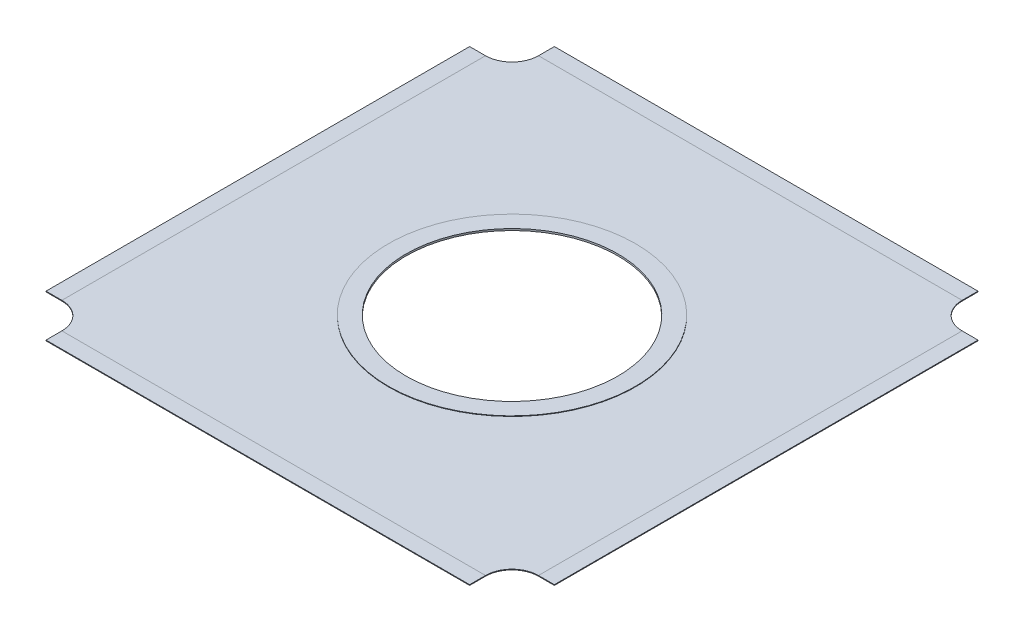
ISO-10303-21;
HEADER;
FILE_DESCRIPTION(('STEP AP214'),'2;1');
FILE_NAME('part.step','',(''),(''),'','','');
FILE_SCHEMA(('AUTOMOTIVE_DESIGN { 1 0 10303 214 1 1 1 1 }'));
ENDSEC;
DATA;
#1=APPLICATION_CONTEXT('core data for automotive mechanical design processes');
#2=APPLICATION_PROTOCOL_DEFINITION('international standard','automotive_design',2000,#1);
#3=PRODUCT_CONTEXT('',#1,'mechanical');
#4=PRODUCT('Part','Part','',(#3));
#5=PRODUCT_RELATED_PRODUCT_CATEGORY('part','',(#4));
#6=PRODUCT_DEFINITION_FORMATION('','',#4);
#7=PRODUCT_DEFINITION_CONTEXT('part definition',#1,'design');
#8=PRODUCT_DEFINITION('design','',#6,#7);
#9=PRODUCT_DEFINITION_SHAPE('','',#8);
#10=(LENGTH_UNIT() NAMED_UNIT(*) SI_UNIT(.MILLI.,.METRE.));
#11=(NAMED_UNIT(*) PLANE_ANGLE_UNIT() SI_UNIT($,.RADIAN.));
#12=(NAMED_UNIT(*) SI_UNIT($,.STERADIAN.) SOLID_ANGLE_UNIT());
#13=UNCERTAINTY_MEASURE_WITH_UNIT(LENGTH_MEASURE(1.E-05),#10,'distance_accuracy_value','');
#14=(GEOMETRIC_REPRESENTATION_CONTEXT(3) GLOBAL_UNCERTAINTY_ASSIGNED_CONTEXT((#13)) GLOBAL_UNIT_ASSIGNED_CONTEXT((#10,
#11,#12)) REPRESENTATION_CONTEXT('',''));
#15=CARTESIAN_POINT('',(0.,0.,0.));
#16=DIRECTION('',(0.,0.,1.));
#17=DIRECTION('',(1.,0.,0.));
#18=AXIS2_PLACEMENT_3D('',#15,#16,#17);
#19=CARTESIAN_POINT('',(0.,0.635,0.));
#20=DIRECTION('',(0.,-1.,0.));
#21=DIRECTION('',(0.,0.,-1.));
#22=AXIS2_PLACEMENT_3D('',#19,#20,#21);
#23=CYLINDRICAL_SURFACE('',#22,76.2);
#24=CARTESIAN_POINT('',(0.,0.635,0.));
#25=DIRECTION('',(0.,1.,0.));
#26=DIRECTION('',(0.,0.,1.));
#27=AXIS2_PLACEMENT_3D('',#24,#25,#26);
#28=CIRCLE('',#27,76.2);
#29=CARTESIAN_POINT('',(0.,0.635,76.2));
#30=VERTEX_POINT('',#29);
#31=EDGE_CURVE('E60',#30,#30,#28,.T.);
#32=ORIENTED_EDGE('',*,*,#31,.T.);
#33=EDGE_LOOP('',(#32));
#34=FACE_BOUND('',#33,.T.);
#35=CARTESIAN_POINT('',(0.,-0.635,0.));
#36=DIRECTION('',(0.,1.,0.));
#37=DIRECTION('',(0.,0.,1.));
#38=AXIS2_PLACEMENT_3D('',#35,#36,#37);
#39=CIRCLE('',#38,76.2);
#40=CARTESIAN_POINT('',(0.,-0.635,76.2));
#41=VERTEX_POINT('',#40);
#42=EDGE_CURVE('E66',#41,#41,#39,.T.);
#43=ORIENTED_EDGE('',*,*,#42,.F.);
#44=EDGE_LOOP('',(#43));
#45=FACE_BOUND('',#44,.T.);
#46=ADVANCED_FACE('F53',(#34,#45),#23,.F.);
#47=CARTESIAN_POINT('',(0.,0.635,0.));
#48=DIRECTION('',(0.,-1.,0.));
#49=DIRECTION('',(0.,0.,-1.));
#50=AXIS2_PLACEMENT_3D('',#47,#48,#49);
#51=CYLINDRICAL_SURFACE('',#50,88.9);
#52=CARTESIAN_POINT('',(0.,0.635,0.));
#53=DIRECTION('',(0.,1.,0.));
#54=DIRECTION('',(0.,0.,1.));
#55=AXIS2_PLACEMENT_3D('',#52,#53,#54);
#56=CIRCLE('',#55,88.9);
#57=CARTESIAN_POINT('',(0.,0.635,88.9));
#58=VERTEX_POINT('',#57);
#59=EDGE_CURVE('E12',#58,#58,#56,.T.);
#60=ORIENTED_EDGE('',*,*,#59,.F.);
#61=EDGE_LOOP('',(#60));
#62=FACE_BOUND('',#61,.T.);
#63=CARTESIAN_POINT('',(0.,-0.635,0.));
#64=DIRECTION('',(0.,1.,0.));
#65=DIRECTION('',(0.,0.,1.));
#66=AXIS2_PLACEMENT_3D('',#63,#64,#65);
#67=CIRCLE('',#66,88.9);
#68=CARTESIAN_POINT('',(0.,-0.635,88.9));
#69=VERTEX_POINT('',#68);
#70=EDGE_CURVE('E56',#69,#69,#67,.T.);
#71=ORIENTED_EDGE('',*,*,#70,.T.);
#72=EDGE_LOOP('',(#71));
#73=FACE_BOUND('',#72,.T.);
#74=ADVANCED_FACE('F73',(#62,#73),#51,.T.);
#75=CARTESIAN_POINT('',(0.,0.635,0.));
#76=DIRECTION('',(0.,1.,0.));
#77=DIRECTION('',(0.,0.,1.));
#78=AXIS2_PLACEMENT_3D('',#75,#76,#77);
#79=PLANE('',#78);
#80=ORIENTED_EDGE('',*,*,#31,.F.);
#81=EDGE_LOOP('',(#80));
#82=FACE_BOUND('',#81,.T.);
#83=ORIENTED_EDGE('',*,*,#59,.T.);
#84=EDGE_LOOP('',(#83));
#85=FACE_BOUND('',#84,.T.);
#86=ADVANCED_FACE('F77',(#82,#85),#79,.T.);
#87=CARTESIAN_POINT('',(0.,-0.635,0.));
#88=DIRECTION('',(0.,1.,0.));
#89=DIRECTION('',(0.,0.,1.));
#90=AXIS2_PLACEMENT_3D('',#87,#88,#89);
#91=PLANE('',#90);
#92=ORIENTED_EDGE('',*,*,#42,.T.);
#93=EDGE_LOOP('',(#92));
#94=FACE_BOUND('',#93,.T.);
#95=ORIENTED_EDGE('',*,*,#70,.F.);
#96=EDGE_LOOP('',(#95));
#97=FACE_BOUND('',#96,.T.);
#98=ADVANCED_FACE('F75',(#94,#97),#91,.F.);
#99=CLOSED_SHELL('',(#46,#74,#86,#98));
#100=MANIFOLD_SOLID_BREP('B2',#99);
#101=CARTESIAN_POINT('',(0.,0.254,0.));
#102=DIRECTION('',(0.,1.,0.));
#103=DIRECTION('',(0.,0.,1.));
#104=AXIS2_PLACEMENT_3D('',#101,#102,#103);
#105=PLANE('',#104);
#106=DIRECTION('',(0.,0.,1.));
#107=VECTOR('',#106,1.);
#108=CARTESIAN_POINT('',(152.400000000001,0.254,7.40148683083457E-13));
#109=LINE('',#108,#107);
#110=CARTESIAN_POINT('',(152.4,0.254,171.45));
#111=VERTEX_POINT('',#110);
#112=CARTESIAN_POINT('',(152.4,0.254,182.88));
#113=VERTEX_POINT('',#112);
#114=EDGE_CURVE('E687',#111,#113,#109,.T.);
#115=ORIENTED_EDGE('',*,*,#114,.F.);
#116=DIRECTION('',(-1.,0.,0.));
#117=VECTOR('',#116,1.);
#118=CARTESIAN_POINT('',(0.,0.254,171.45));
#119=LINE('',#118,#117);
#120=CARTESIAN_POINT('',(-152.4,0.254,171.45));
#121=VERTEX_POINT('',#120);
#122=EDGE_CURVE('E51',#111,#121,#119,.T.);
#123=ORIENTED_EDGE('',*,*,#122,.T.);
#124=DIRECTION('',(0.,0.,1.));
#125=VECTOR('',#124,1.);
#126=CARTESIAN_POINT('',(-152.399999999998,0.254,-1.48029736616687E-12));
#127=LINE('',#126,#125);
#128=CARTESIAN_POINT('',(-152.4,0.254,182.88));
#129=VERTEX_POINT('',#128);
#130=EDGE_CURVE('E383',#121,#129,#127,.T.);
#131=ORIENTED_EDGE('',*,*,#130,.T.);
#132=DIRECTION('',(1.,0.,0.));
#133=VECTOR('',#132,1.);
#134=CARTESIAN_POINT('',(0.,0.254,182.88));
#135=LINE('',#134,#133);
#136=EDGE_CURVE('E685',#129,#113,#135,.T.);
#137=ORIENTED_EDGE('',*,*,#136,.T.);
#138=EDGE_LOOP('',(#115,#123,#131,#137));
#139=FACE_BOUND('',#138,.T.);
#140=ADVANCED_FACE('F132',(#139),#105,.T.);
#141=CARTESIAN_POINT('',(0.,-0.254,0.));
#142=DIRECTION('',(0.,1.,0.));
#143=DIRECTION('',(0.,0.,1.));
#144=AXIS2_PLACEMENT_3D('',#141,#142,#143);
#145=PLANE('',#144);
#146=CARTESIAN_POINT('',(0.,-0.254,0.));
#147=DIRECTION('',(0.,1.,0.));
#148=DIRECTION('',(0.,0.,1.));
#149=AXIS2_PLACEMENT_3D('',#146,#147,#148);
#150=CIRCLE('',#149,88.9);
#151=CARTESIAN_POINT('',(0.,-0.254,88.9));
#152=VERTEX_POINT('',#151);
#153=EDGE_CURVE('E324',#152,#152,#150,.T.);
#154=ORIENTED_EDGE('',*,*,#153,.T.);
#155=EDGE_LOOP('',(#154));
#156=FACE_BOUND('',#155,.T.);
#157=CARTESIAN_POINT('',(171.45,-0.254,171.45));
#158=DIRECTION('',(0.,1.,0.));
#159=DIRECTION('',(0.,0.,1.));
#160=AXIS2_PLACEMENT_3D('',#157,#158,#159);
#161=CIRCLE('',#160,19.05);
#162=CARTESIAN_POINT('',(152.4,-0.254,171.45));
#163=VERTEX_POINT('',#162);
#164=CARTESIAN_POINT('',(171.45,-0.254,152.4));
#165=VERTEX_POINT('',#164);
#166=EDGE_CURVE('E304',#163,#165,#161,.F.);
#167=ORIENTED_EDGE('',*,*,#166,.F.);
#168=DIRECTION('',(-1.,0.,0.));
#169=VECTOR('',#168,1.);
#170=CARTESIAN_POINT('',(0.,-0.254,171.45));
#171=LINE('',#170,#169);
#172=CARTESIAN_POINT('',(-152.4,-0.254,171.45));
#173=VERTEX_POINT('',#172);
#174=EDGE_CURVE('E141',#163,#173,#171,.T.);
#175=ORIENTED_EDGE('',*,*,#174,.T.);
#176=CARTESIAN_POINT('',(-171.45,-0.254,171.45));
#177=DIRECTION('',(0.,1.,0.));
#178=DIRECTION('',(0.,0.,1.));
#179=AXIS2_PLACEMENT_3D('',#176,#177,#178);
#180=CIRCLE('',#179,19.05);
#181=CARTESIAN_POINT('',(-171.45,-0.254,152.4));
#182=VERTEX_POINT('',#181);
#183=EDGE_CURVE('E293',#173,#182,#180,.T.);
#184=ORIENTED_EDGE('',*,*,#183,.T.);
#185=DIRECTION('',(0.,0.,1.));
#186=VECTOR('',#185,1.);
#187=CARTESIAN_POINT('',(-171.45,-0.254,0.));
#188=LINE('',#187,#186);
#189=CARTESIAN_POINT('',(-171.45,-0.254,-152.4));
#190=VERTEX_POINT('',#189);
#191=EDGE_CURVE('E363',#190,#182,#188,.T.);
#192=ORIENTED_EDGE('',*,*,#191,.F.);
#193=CARTESIAN_POINT('',(-171.45,-0.254,-171.45));
#194=DIRECTION('',(0.,1.,0.));
#195=DIRECTION('',(0.,0.,1.));
#196=AXIS2_PLACEMENT_3D('',#193,#194,#195);
#197=CIRCLE('',#196,19.05);
#198=CARTESIAN_POINT('',(-152.4,-0.254,-171.45));
#199=VERTEX_POINT('',#198);
#200=EDGE_CURVE('E282',#190,#199,#197,.T.);
#201=ORIENTED_EDGE('',*,*,#200,.T.);
#202=DIRECTION('',(1.,0.,0.));
#203=VECTOR('',#202,1.);
#204=CARTESIAN_POINT('',(0.,-0.254,-171.45));
#205=LINE('',#204,#203);
#206=CARTESIAN_POINT('',(152.4,-0.254,-171.45));
#207=VERTEX_POINT('',#206);
#208=EDGE_CURVE('E208',#199,#207,#205,.T.);
#209=ORIENTED_EDGE('',*,*,#208,.T.);
#210=CARTESIAN_POINT('',(171.45,-0.254,-171.45));
#211=DIRECTION('',(0.,1.,0.));
#212=DIRECTION('',(0.,0.,1.));
#213=AXIS2_PLACEMENT_3D('',#210,#211,#212);
#214=CIRCLE('',#213,19.05);
#215=CARTESIAN_POINT('',(171.45,-0.254,-152.4));
#216=VERTEX_POINT('',#215);
#217=EDGE_CURVE('E316',#216,#207,#214,.F.);
#218=ORIENTED_EDGE('',*,*,#217,.F.);
#219=DIRECTION('',(0.,0.,1.));
#220=VECTOR('',#219,1.);
#221=CARTESIAN_POINT('',(171.45,-0.254,0.));
#222=LINE('',#221,#220);
#223=EDGE_CURVE('E368',#216,#165,#222,.T.);
#224=ORIENTED_EDGE('',*,*,#223,.T.);
#225=EDGE_LOOP('',(#167,#175,#184,#192,#201,#209,#218,#224));
#226=FACE_BOUND('',#225,.T.);
#227=ADVANCED_FACE('F373',(#156,#226),#145,.F.);
#228=DIRECTION('',(1.,0.,0.));
#229=VECTOR('',#228,1.);
#230=CARTESIAN_POINT('',(7.40148683083446E-13,0.254,-152.400000000001));
#231=LINE('',#230,#229);
#232=CARTESIAN_POINT('',(171.45,0.254,-152.4));
#233=VERTEX_POINT('',#232);
#234=CARTESIAN_POINT('',(182.88,0.254,-152.4));
#235=VERTEX_POINT('',#234);
#236=EDGE_CURVE('E697',#233,#235,#231,.T.);
#237=ORIENTED_EDGE('',*,*,#236,.F.);
#238=DIRECTION('',(0.,0.,1.));
#239=VECTOR('',#238,1.);
#240=CARTESIAN_POINT('',(171.45,0.254,0.));
#241=LINE('',#240,#239);
#242=CARTESIAN_POINT('',(171.45,0.254,152.4));
#243=VERTEX_POINT('',#242);
#244=EDGE_CURVE('E370',#233,#243,#241,.T.);
#245=ORIENTED_EDGE('',*,*,#244,.T.);
#246=DIRECTION('',(1.,0.,0.));
#247=VECTOR('',#246,1.);
#248=CARTESIAN_POINT('',(0.,0.254,152.4));
#249=LINE('',#248,#247);
#250=CARTESIAN_POINT('',(182.88,0.254,152.4));
#251=VERTEX_POINT('',#250);
#252=EDGE_CURVE('E692',#243,#251,#249,.T.);
#253=ORIENTED_EDGE('',*,*,#252,.T.);
#254=DIRECTION('',(0.,0.,1.));
#255=VECTOR('',#254,1.);
#256=CARTESIAN_POINT('',(182.88,0.254,0.));
#257=LINE('',#256,#255);
#258=EDGE_CURVE('E694',#235,#251,#257,.T.);
#259=ORIENTED_EDGE('',*,*,#258,.F.);
#260=EDGE_LOOP('',(#237,#245,#253,#259));
#261=FACE_BOUND('',#260,.T.);
#262=ADVANCED_FACE('F423',(#261),#105,.T.);
#263=ORIENTED_EDGE('',*,*,#174,.F.);
#264=DIRECTION('',(0.,0.,1.));
#265=VECTOR('',#264,1.);
#266=CARTESIAN_POINT('',(152.400000000001,-0.254,7.40148683083457E-13));
#267=LINE('',#266,#265);
#268=CARTESIAN_POINT('',(152.4,-0.254,182.88));
#269=VERTEX_POINT('',#268);
#270=EDGE_CURVE('E301',#163,#269,#267,.T.);
#271=ORIENTED_EDGE('',*,*,#270,.T.);
#272=DIRECTION('',(1.,0.,0.));
#273=VECTOR('',#272,1.);
#274=CARTESIAN_POINT('',(0.,-0.254,182.88));
#275=LINE('',#274,#273);
#276=CARTESIAN_POINT('',(-152.4,-0.254,182.88));
#277=VERTEX_POINT('',#276);
#278=EDGE_CURVE('E298',#277,#269,#275,.T.);
#279=ORIENTED_EDGE('',*,*,#278,.F.);
#280=DIRECTION('',(0.,0.,1.));
#281=VECTOR('',#280,1.);
#282=CARTESIAN_POINT('',(-152.399999999998,-0.254,-1.48029736616687E-12));
#283=LINE('',#282,#281);
#284=EDGE_CURVE('E296',#173,#277,#283,.T.);
#285=ORIENTED_EDGE('',*,*,#284,.F.);
#286=EDGE_LOOP('',(#263,#271,#279,#285));
#287=FACE_BOUND('',#286,.T.);
#288=ADVANCED_FACE('F388',(#287),#145,.F.);
#289=DIRECTION('',(0.,0.,1.));
#290=VECTOR('',#289,1.);
#291=CARTESIAN_POINT('',(-152.399999999999,0.254,7.40148683083432E-13));
#292=LINE('',#291,#290);
#293=CARTESIAN_POINT('',(-152.4,0.254,-182.88));
#294=VERTEX_POINT('',#293);
#295=CARTESIAN_POINT('',(-152.4,0.254,-171.45));
#296=VERTEX_POINT('',#295);
#297=EDGE_CURVE('E273',#294,#296,#292,.T.);
#298=ORIENTED_EDGE('',*,*,#297,.T.);
#299=DIRECTION('',(1.,0.,0.));
#300=VECTOR('',#299,1.);
#301=CARTESIAN_POINT('',(0.,0.254,-171.45));
#302=LINE('',#301,#300);
#303=CARTESIAN_POINT('',(152.4,0.254,-171.45));
#304=VERTEX_POINT('',#303);
#305=EDGE_CURVE('E149',#296,#304,#302,.T.);
#306=ORIENTED_EDGE('',*,*,#305,.T.);
#307=DIRECTION('',(0.,0.,1.));
#308=VECTOR('',#307,1.);
#309=CARTESIAN_POINT('',(152.400000000001,0.254,-7.40148683083446E-13));
#310=LINE('',#309,#308);
#311=CARTESIAN_POINT('',(152.4,0.254,-182.88));
#312=VERTEX_POINT('',#311);
#313=EDGE_CURVE('E258',#312,#304,#310,.T.);
#314=ORIENTED_EDGE('',*,*,#313,.F.);
#315=DIRECTION('',(1.,0.,0.));
#316=VECTOR('',#315,1.);
#317=CARTESIAN_POINT('',(0.,0.254,-182.88));
#318=LINE('',#317,#316);
#319=EDGE_CURVE('E269',#294,#312,#318,.T.);
#320=ORIENTED_EDGE('',*,*,#319,.F.);
#321=EDGE_LOOP('',(#298,#306,#314,#320));
#322=FACE_BOUND('',#321,.T.);
#323=ADVANCED_FACE('F268',(#322),#105,.T.);
#324=ORIENTED_EDGE('',*,*,#223,.F.);
#325=DIRECTION('',(1.,0.,0.));
#326=VECTOR('',#325,1.);
#327=CARTESIAN_POINT('',(7.40148683083446E-13,-0.254,-152.400000000001));
#328=LINE('',#327,#326);
#329=CARTESIAN_POINT('',(182.88,-0.254,-152.4));
#330=VERTEX_POINT('',#329);
#331=EDGE_CURVE('E313',#216,#330,#328,.T.);
#332=ORIENTED_EDGE('',*,*,#331,.T.);
#333=DIRECTION('',(0.,0.,1.));
#334=VECTOR('',#333,1.);
#335=CARTESIAN_POINT('',(182.88,-0.254,0.));
#336=LINE('',#335,#334);
#337=CARTESIAN_POINT('',(182.88,-0.254,152.4));
#338=VERTEX_POINT('',#337);
#339=EDGE_CURVE('E310',#330,#338,#336,.T.);
#340=ORIENTED_EDGE('',*,*,#339,.T.);
#341=DIRECTION('',(1.,0.,0.));
#342=VECTOR('',#341,1.);
#343=CARTESIAN_POINT('',(0.,-0.254,152.4));
#344=LINE('',#343,#342);
#345=EDGE_CURVE('E307',#165,#338,#344,.T.);
#346=ORIENTED_EDGE('',*,*,#345,.F.);
#347=EDGE_LOOP('',(#324,#332,#340,#346));
#348=FACE_BOUND('',#347,.T.);
#349=ADVANCED_FACE('F426',(#348),#145,.F.);
#350=ORIENTED_EDGE('',*,*,#122,.F.);
#351=CARTESIAN_POINT('',(171.45,0.254,171.45));
#352=DIRECTION('',(0.,1.,0.));
#353=DIRECTION('',(0.,0.,1.));
#354=AXIS2_PLACEMENT_3D('',#351,#352,#353);
#355=CIRCLE('',#354,19.05);
#356=EDGE_CURVE('E690',#111,#243,#355,.F.);
#357=ORIENTED_EDGE('',*,*,#356,.T.);
#358=ORIENTED_EDGE('',*,*,#244,.F.);
#359=CARTESIAN_POINT('',(171.45,0.254,-171.45));
#360=DIRECTION('',(0.,1.,0.));
#361=DIRECTION('',(0.,0.,1.));
#362=AXIS2_PLACEMENT_3D('',#359,#360,#361);
#363=CIRCLE('',#362,19.05);
#364=EDGE_CURVE('E270',#233,#304,#363,.F.);
#365=ORIENTED_EDGE('',*,*,#364,.T.);
#366=ORIENTED_EDGE('',*,*,#305,.F.);
#367=CARTESIAN_POINT('',(-171.45,0.254,-171.45));
#368=DIRECTION('',(0.,1.,0.));
#369=DIRECTION('',(0.,0.,1.));
#370=AXIS2_PLACEMENT_3D('',#367,#368,#369);
#371=CIRCLE('',#370,19.05);
#372=CARTESIAN_POINT('',(-171.45,0.254,-152.4));
#373=VERTEX_POINT('',#372);
#374=EDGE_CURVE('E327',#373,#296,#371,.T.);
#375=ORIENTED_EDGE('',*,*,#374,.F.);
#376=DIRECTION('',(0.,0.,1.));
#377=VECTOR('',#376,1.);
#378=CARTESIAN_POINT('',(-171.45,0.254,0.));
#379=LINE('',#378,#377);
#380=CARTESIAN_POINT('',(-171.45,0.254,152.4));
#381=VERTEX_POINT('',#380);
#382=EDGE_CURVE('E217',#373,#381,#379,.T.);
#383=ORIENTED_EDGE('',*,*,#382,.T.);
#384=CARTESIAN_POINT('',(-171.45,0.254,171.45));
#385=DIRECTION('',(0.,1.,0.));
#386=DIRECTION('',(0.,0.,1.));
#387=AXIS2_PLACEMENT_3D('',#384,#385,#386);
#388=CIRCLE('',#387,19.05);
#389=EDGE_CURVE('E392',#121,#381,#388,.T.);
#390=ORIENTED_EDGE('',*,*,#389,.F.);
#391=EDGE_LOOP('',(#350,#357,#358,#365,#366,#375,#383,#390));
#392=FACE_BOUND('',#391,.T.);
#393=CARTESIAN_POINT('',(0.,0.254,0.));
#394=DIRECTION('',(0.,1.,0.));
#395=DIRECTION('',(0.,0.,1.));
#396=AXIS2_PLACEMENT_3D('',#393,#394,#395);
#397=CIRCLE('',#396,88.9);
#398=CARTESIAN_POINT('',(0.,0.254,88.9));
#399=VERTEX_POINT('',#398);
#400=EDGE_CURVE('E275',#399,#399,#397,.T.);
#401=ORIENTED_EDGE('',*,*,#400,.F.);
#402=EDGE_LOOP('',(#401));
#403=FACE_BOUND('',#402,.T.);
#404=ADVANCED_FACE('F420',(#392,#403),#105,.T.);
#405=DIRECTION('',(-1.,0.,0.));
#406=VECTOR('',#405,1.);
#407=CARTESIAN_POINT('',(0.,-0.254,-152.4));
#408=LINE('',#407,#406);
#409=CARTESIAN_POINT('',(-182.88,-0.254,-152.4));
#410=VERTEX_POINT('',#409);
#411=EDGE_CURVE('E285',#190,#410,#408,.T.);
#412=ORIENTED_EDGE('',*,*,#411,.F.);
#413=ORIENTED_EDGE('',*,*,#191,.T.);
#414=DIRECTION('',(-1.,0.,0.));
#415=VECTOR('',#414,1.);
#416=CARTESIAN_POINT('',(0.,-0.254,152.4));
#417=LINE('',#416,#415);
#418=CARTESIAN_POINT('',(-182.88,-0.254,152.4));
#419=VERTEX_POINT('',#418);
#420=EDGE_CURVE('E290',#182,#419,#417,.T.);
#421=ORIENTED_EDGE('',*,*,#420,.T.);
#422=DIRECTION('',(0.,0.,1.));
#423=VECTOR('',#422,1.);
#424=CARTESIAN_POINT('',(-182.88,-0.254,0.));
#425=LINE('',#424,#423);
#426=EDGE_CURVE('E287',#410,#419,#425,.T.);
#427=ORIENTED_EDGE('',*,*,#426,.F.);
#428=EDGE_LOOP('',(#412,#413,#421,#427));
#429=FACE_BOUND('',#428,.T.);
#430=ADVANCED_FACE('F400',(#429),#145,.F.);
#431=CARTESIAN_POINT('',(-171.45,0.254,-171.45));
#432=DIRECTION('',(0.,-1.,0.));
#433=DIRECTION('',(0.,0.,-1.));
#434=AXIS2_PLACEMENT_3D('',#431,#432,#433);
#435=CYLINDRICAL_SURFACE('',#434,19.05);
#436=ORIENTED_EDGE('',*,*,#200,.F.);
#437=DIRECTION('',(0.,-1.,0.));
#438=VECTOR('',#437,1.);
#439=CARTESIAN_POINT('',(-171.45,0.254,-152.4));
#440=LINE('',#439,#438);
#441=EDGE_CURVE('E360',#373,#190,#440,.T.);
#442=ORIENTED_EDGE('',*,*,#441,.F.);
#443=ORIENTED_EDGE('',*,*,#374,.T.);
#444=DIRECTION('',(0.,-1.,0.));
#445=VECTOR('',#444,1.);
#446=CARTESIAN_POINT('',(-152.4,0.254,-171.45));
#447=LINE('',#446,#445);
#448=EDGE_CURVE('E281',#296,#199,#447,.T.);
#449=ORIENTED_EDGE('',*,*,#448,.T.);
#450=EDGE_LOOP('',(#436,#442,#443,#449));
#451=FACE_BOUND('',#450,.T.);
#452=ADVANCED_FACE('F134',(#451),#435,.F.);
#453=CARTESIAN_POINT('',(0.,0.254,-152.4));
#454=DIRECTION('',(0.,0.,1.));
#455=DIRECTION('',(1.,0.,0.));
#456=AXIS2_PLACEMENT_3D('',#453,#454,#455);
#457=PLANE('',#456);
#458=ORIENTED_EDGE('',*,*,#411,.T.);
#459=DIRECTION('',(0.,-1.,0.));
#460=VECTOR('',#459,1.);
#461=CARTESIAN_POINT('',(-182.88,0.254,-152.4));
#462=LINE('',#461,#460);
#463=CARTESIAN_POINT('',(-182.88,0.254,-152.4));
#464=VERTEX_POINT('',#463);
#465=EDGE_CURVE('E357',#464,#410,#462,.T.);
#466=ORIENTED_EDGE('',*,*,#465,.F.);
#467=DIRECTION('',(-1.,0.,0.));
#468=VECTOR('',#467,1.);
#469=CARTESIAN_POINT('',(0.,0.254,-152.4));
#470=LINE('',#469,#468);
#471=EDGE_CURVE('E406',#373,#464,#470,.T.);
#472=ORIENTED_EDGE('',*,*,#471,.F.);
#473=ORIENTED_EDGE('',*,*,#441,.T.);
#474=EDGE_LOOP('',(#458,#466,#472,#473));
#475=FACE_BOUND('',#474,.T.);
#476=ADVANCED_FACE('F404',(#475),#457,.F.);
#477=CARTESIAN_POINT('',(-182.88,0.254,0.));
#478=DIRECTION('',(1.,0.,0.));
#479=DIRECTION('',(0.,0.,-1.));
#480=AXIS2_PLACEMENT_3D('',#477,#478,#479);
#481=PLANE('',#480);
#482=ORIENTED_EDGE('',*,*,#426,.T.);
#483=DIRECTION('',(0.,-1.,0.));
#484=VECTOR('',#483,1.);
#485=CARTESIAN_POINT('',(-182.88,0.254,152.4));
#486=LINE('',#485,#484);
#487=CARTESIAN_POINT('',(-182.88,0.254,152.4));
#488=VERTEX_POINT('',#487);
#489=EDGE_CURVE('E355',#488,#419,#486,.T.);
#490=ORIENTED_EDGE('',*,*,#489,.F.);
#491=DIRECTION('',(0.,0.,1.));
#492=VECTOR('',#491,1.);
#493=CARTESIAN_POINT('',(-182.88,0.254,0.));
#494=LINE('',#493,#492);
#495=EDGE_CURVE('E676',#464,#488,#494,.T.);
#496=ORIENTED_EDGE('',*,*,#495,.F.);
#497=ORIENTED_EDGE('',*,*,#465,.T.);
#498=EDGE_LOOP('',(#482,#490,#496,#497));
#499=FACE_BOUND('',#498,.T.);
#500=ADVANCED_FACE('F497',(#499),#481,.F.);
#501=CARTESIAN_POINT('',(0.,0.254,152.4));
#502=DIRECTION('',(0.,0.,1.));
#503=DIRECTION('',(1.,0.,0.));
#504=AXIS2_PLACEMENT_3D('',#501,#502,#503);
#505=PLANE('',#504);
#506=ORIENTED_EDGE('',*,*,#420,.F.);
#507=DIRECTION('',(0.,-1.,0.));
#508=VECTOR('',#507,1.);
#509=CARTESIAN_POINT('',(-171.45,0.254,152.4));
#510=LINE('',#509,#508);
#511=EDGE_CURVE('E352',#381,#182,#510,.T.);
#512=ORIENTED_EDGE('',*,*,#511,.F.);
#513=DIRECTION('',(-1.,0.,0.));
#514=VECTOR('',#513,1.);
#515=CARTESIAN_POINT('',(0.,0.254,152.4));
#516=LINE('',#515,#514);
#517=EDGE_CURVE('E677',#381,#488,#516,.T.);
#518=ORIENTED_EDGE('',*,*,#517,.T.);
#519=ORIENTED_EDGE('',*,*,#489,.T.);
#520=EDGE_LOOP('',(#506,#512,#518,#519));
#521=FACE_BOUND('',#520,.T.);
#522=ADVANCED_FACE('F395',(#521),#505,.T.);
#523=CARTESIAN_POINT('',(-171.45,0.254,171.45));
#524=DIRECTION('',(0.,-1.,0.));
#525=DIRECTION('',(0.,0.,-1.));
#526=AXIS2_PLACEMENT_3D('',#523,#524,#525);
#527=CYLINDRICAL_SURFACE('',#526,19.05);
#528=ORIENTED_EDGE('',*,*,#183,.F.);
#529=DIRECTION('',(0.,-1.,0.));
#530=VECTOR('',#529,1.);
#531=CARTESIAN_POINT('',(-152.4,0.254,171.45));
#532=LINE('',#531,#530);
#533=EDGE_CURVE('E349',#121,#173,#532,.T.);
#534=ORIENTED_EDGE('',*,*,#533,.F.);
#535=ORIENTED_EDGE('',*,*,#389,.T.);
#536=ORIENTED_EDGE('',*,*,#511,.T.);
#537=EDGE_LOOP('',(#528,#534,#535,#536));
#538=FACE_BOUND('',#537,.T.);
#539=ADVANCED_FACE('F389',(#538),#527,.F.);
#540=CARTESIAN_POINT('',(-152.399999999998,0.254,-1.48029736616687E-12));
#541=DIRECTION('',(1.,0.,0.));
#542=DIRECTION('',(0.,0.,-1.));
#543=AXIS2_PLACEMENT_3D('',#540,#541,#542);
#544=PLANE('',#543);
#545=ORIENTED_EDGE('',*,*,#284,.T.);
#546=DIRECTION('',(0.,-1.,0.));
#547=VECTOR('',#546,1.);
#548=CARTESIAN_POINT('',(-152.4,0.254,182.88));
#549=LINE('',#548,#547);
#550=EDGE_CURVE('E346',#129,#277,#549,.T.);
#551=ORIENTED_EDGE('',*,*,#550,.F.);
#552=ORIENTED_EDGE('',*,*,#130,.F.);
#553=ORIENTED_EDGE('',*,*,#533,.T.);
#554=EDGE_LOOP('',(#545,#551,#552,#553));
#555=FACE_BOUND('',#554,.T.);
#556=ADVANCED_FACE('F381',(#555),#544,.F.);
#557=CARTESIAN_POINT('',(0.,0.254,182.88));
#558=DIRECTION('',(0.,0.,-1.));
#559=DIRECTION('',(-1.,0.,0.));
#560=AXIS2_PLACEMENT_3D('',#557,#558,#559);
#561=PLANE('',#560);
#562=ORIENTED_EDGE('',*,*,#278,.T.);
#563=DIRECTION('',(0.,-1.,0.));
#564=VECTOR('',#563,1.);
#565=CARTESIAN_POINT('',(152.4,0.254,182.88));
#566=LINE('',#565,#564);
#567=EDGE_CURVE('E344',#113,#269,#566,.T.);
#568=ORIENTED_EDGE('',*,*,#567,.F.);
#569=ORIENTED_EDGE('',*,*,#136,.F.);
#570=ORIENTED_EDGE('',*,*,#550,.T.);
#571=EDGE_LOOP('',(#562,#568,#569,#570));
#572=FACE_BOUND('',#571,.T.);
#573=ADVANCED_FACE('F486',(#572),#561,.F.);
#574=CARTESIAN_POINT('',(152.400000000001,0.254,7.40148683083457E-13));
#575=DIRECTION('',(1.,0.,0.));
#576=DIRECTION('',(0.,0.,-1.));
#577=AXIS2_PLACEMENT_3D('',#574,#575,#576);
#578=PLANE('',#577);
#579=ORIENTED_EDGE('',*,*,#270,.F.);
#580=DIRECTION('',(0.,-1.,0.));
#581=VECTOR('',#580,1.);
#582=CARTESIAN_POINT('',(152.4,0.254,171.45));
#583=LINE('',#582,#581);
#584=EDGE_CURVE('E341',#111,#163,#583,.T.);
#585=ORIENTED_EDGE('',*,*,#584,.F.);
#586=ORIENTED_EDGE('',*,*,#114,.T.);
#587=ORIENTED_EDGE('',*,*,#567,.T.);
#588=EDGE_LOOP('',(#579,#585,#586,#587));
#589=FACE_BOUND('',#588,.T.);
#590=ADVANCED_FACE('F482',(#589),#578,.T.);
#591=CARTESIAN_POINT('',(171.45,0.254,171.45));
#592=DIRECTION('',(0.,-1.,0.));
#593=DIRECTION('',(0.,0.,-1.));
#594=AXIS2_PLACEMENT_3D('',#591,#592,#593);
#595=CYLINDRICAL_SURFACE('',#594,19.05);
#596=ORIENTED_EDGE('',*,*,#166,.T.);
#597=DIRECTION('',(0.,-1.,0.));
#598=VECTOR('',#597,1.);
#599=CARTESIAN_POINT('',(171.45,0.254,152.4));
#600=LINE('',#599,#598);
#601=EDGE_CURVE('E338',#243,#165,#600,.T.);
#602=ORIENTED_EDGE('',*,*,#601,.F.);
#603=ORIENTED_EDGE('',*,*,#356,.F.);
#604=ORIENTED_EDGE('',*,*,#584,.T.);
#605=EDGE_LOOP('',(#596,#602,#603,#604));
#606=FACE_BOUND('',#605,.T.);
#607=ADVANCED_FACE('F478',(#606),#595,.F.);
#608=CARTESIAN_POINT('',(0.,0.254,152.4));
#609=DIRECTION('',(0.,0.,-1.));
#610=DIRECTION('',(-1.,0.,0.));
#611=AXIS2_PLACEMENT_3D('',#608,#609,#610);
#612=PLANE('',#611);
#613=ORIENTED_EDGE('',*,*,#345,.T.);
#614=DIRECTION('',(0.,-1.,0.));
#615=VECTOR('',#614,1.);
#616=CARTESIAN_POINT('',(182.88,0.254,152.4));
#617=LINE('',#616,#615);
#618=EDGE_CURVE('E336',#251,#338,#617,.T.);
#619=ORIENTED_EDGE('',*,*,#618,.F.);
#620=ORIENTED_EDGE('',*,*,#252,.F.);
#621=ORIENTED_EDGE('',*,*,#601,.T.);
#622=EDGE_LOOP('',(#613,#619,#620,#621));
#623=FACE_BOUND('',#622,.T.);
#624=ADVANCED_FACE('F474',(#623),#612,.F.);
#625=CARTESIAN_POINT('',(182.88,0.254,0.));
#626=DIRECTION('',(1.,0.,0.));
#627=DIRECTION('',(0.,0.,-1.));
#628=AXIS2_PLACEMENT_3D('',#625,#626,#627);
#629=PLANE('',#628);
#630=ORIENTED_EDGE('',*,*,#339,.F.);
#631=DIRECTION('',(0.,-1.,0.));
#632=VECTOR('',#631,1.);
#633=CARTESIAN_POINT('',(182.88,0.254,-152.4));
#634=LINE('',#633,#632);
#635=EDGE_CURVE('E334',#235,#330,#634,.T.);
#636=ORIENTED_EDGE('',*,*,#635,.F.);
#637=ORIENTED_EDGE('',*,*,#258,.T.);
#638=ORIENTED_EDGE('',*,*,#618,.T.);
#639=EDGE_LOOP('',(#630,#636,#637,#638));
#640=FACE_BOUND('',#639,.T.);
#641=ADVANCED_FACE('F470',(#640),#629,.T.);
#642=CARTESIAN_POINT('',(7.40148683083446E-13,0.254,-152.400000000001));
#643=DIRECTION('',(0.,0.,-1.));
#644=DIRECTION('',(-1.,0.,0.));
#645=AXIS2_PLACEMENT_3D('',#642,#643,#644);
#646=PLANE('',#645);
#647=ORIENTED_EDGE('',*,*,#331,.F.);
#648=DIRECTION('',(0.,-1.,0.));
#649=VECTOR('',#648,1.);
#650=CARTESIAN_POINT('',(171.45,0.254,-152.4));
#651=LINE('',#650,#649);
#652=EDGE_CURVE('E331',#233,#216,#651,.T.);
#653=ORIENTED_EDGE('',*,*,#652,.F.);
#654=ORIENTED_EDGE('',*,*,#236,.T.);
#655=ORIENTED_EDGE('',*,*,#635,.T.);
#656=EDGE_LOOP('',(#647,#653,#654,#655));
#657=FACE_BOUND('',#656,.T.);
#658=ADVANCED_FACE('F466',(#657),#646,.T.);
#659=CARTESIAN_POINT('',(171.45,0.254,-171.45));
#660=DIRECTION('',(0.,-1.,0.));
#661=DIRECTION('',(0.,0.,-1.));
#662=AXIS2_PLACEMENT_3D('',#659,#660,#661);
#663=CYLINDRICAL_SURFACE('',#662,19.05);
#664=ORIENTED_EDGE('',*,*,#217,.T.);
#665=DIRECTION('',(0.,-1.,0.));
#666=VECTOR('',#665,1.);
#667=CARTESIAN_POINT('',(152.4,0.254,-171.45));
#668=LINE('',#667,#666);
#669=EDGE_CURVE('E264',#304,#207,#668,.T.);
#670=ORIENTED_EDGE('',*,*,#669,.F.);
#671=ORIENTED_EDGE('',*,*,#364,.F.);
#672=ORIENTED_EDGE('',*,*,#652,.T.);
#673=EDGE_LOOP('',(#664,#670,#671,#672));
#674=FACE_BOUND('',#673,.T.);
#675=ADVANCED_FACE('F463',(#674),#663,.F.);
#676=CARTESIAN_POINT('',(152.400000000001,0.254,-7.40148683083446E-13));
#677=DIRECTION('',(1.,0.,0.));
#678=DIRECTION('',(0.,0.,-1.));
#679=AXIS2_PLACEMENT_3D('',#676,#677,#678);
#680=PLANE('',#679);
#681=DIRECTION('',(0.,0.,1.));
#682=VECTOR('',#681,1.);
#683=CARTESIAN_POINT('',(152.400000000001,-0.254,-7.40148683083446E-13));
#684=LINE('',#683,#682);
#685=CARTESIAN_POINT('',(152.4,-0.254,-182.88));
#686=VERTEX_POINT('',#685);
#687=EDGE_CURVE('E259',#686,#207,#684,.T.);
#688=ORIENTED_EDGE('',*,*,#687,.F.);
#689=DIRECTION('',(0.,-1.,0.));
#690=VECTOR('',#689,1.);
#691=CARTESIAN_POINT('',(152.4,0.254,-182.88));
#692=LINE('',#691,#690);
#693=EDGE_CURVE('E254',#312,#686,#692,.T.);
#694=ORIENTED_EDGE('',*,*,#693,.F.);
#695=ORIENTED_EDGE('',*,*,#313,.T.);
#696=ORIENTED_EDGE('',*,*,#669,.T.);
#697=EDGE_LOOP('',(#688,#694,#695,#696));
#698=FACE_BOUND('',#697,.T.);
#699=ADVANCED_FACE('F256',(#698),#680,.T.);
#700=CARTESIAN_POINT('',(0.,0.254,-182.88));
#701=DIRECTION('',(0.,0.,-1.));
#702=DIRECTION('',(-1.,0.,0.));
#703=AXIS2_PLACEMENT_3D('',#700,#701,#702);
#704=PLANE('',#703);
#705=DIRECTION('',(1.,0.,0.));
#706=VECTOR('',#705,1.);
#707=CARTESIAN_POINT('',(0.,-0.254,-182.88));
#708=LINE('',#707,#706);
#709=CARTESIAN_POINT('',(-152.4,-0.254,-182.88));
#710=VERTEX_POINT('',#709);
#711=EDGE_CURVE('E320',#710,#686,#708,.T.);
#712=ORIENTED_EDGE('',*,*,#711,.F.);
#713=DIRECTION('',(0.,-1.,0.));
#714=VECTOR('',#713,1.);
#715=CARTESIAN_POINT('',(-152.4,0.254,-182.88));
#716=LINE('',#715,#714);
#717=EDGE_CURVE('E202',#294,#710,#716,.T.);
#718=ORIENTED_EDGE('',*,*,#717,.F.);
#719=ORIENTED_EDGE('',*,*,#319,.T.);
#720=ORIENTED_EDGE('',*,*,#693,.T.);
#721=EDGE_LOOP('',(#712,#718,#719,#720));
#722=FACE_BOUND('',#721,.T.);
#723=ADVANCED_FACE('F272',(#722),#704,.T.);
#724=CARTESIAN_POINT('',(-152.399999999999,0.254,7.40148683083432E-13));
#725=DIRECTION('',(1.,0.,0.));
#726=DIRECTION('',(0.,0.,-1.));
#727=AXIS2_PLACEMENT_3D('',#724,#725,#726);
#728=PLANE('',#727);
#729=DIRECTION('',(0.,0.,1.));
#730=VECTOR('',#729,1.);
#731=CARTESIAN_POINT('',(-152.399999999999,-0.254,7.40148683083432E-13));
#732=LINE('',#731,#730);
#733=EDGE_CURVE('E322',#710,#199,#732,.T.);
#734=ORIENTED_EDGE('',*,*,#733,.T.);
#735=ORIENTED_EDGE('',*,*,#448,.F.);
#736=ORIENTED_EDGE('',*,*,#297,.F.);
#737=ORIENTED_EDGE('',*,*,#717,.T.);
#738=EDGE_LOOP('',(#734,#735,#736,#737));
#739=FACE_BOUND('',#738,.T.);
#740=ADVANCED_FACE('F410',(#739),#728,.F.);
#741=CARTESIAN_POINT('',(0.,0.254,0.));
#742=DIRECTION('',(0.,-1.,0.));
#743=DIRECTION('',(0.,0.,-1.));
#744=AXIS2_PLACEMENT_3D('',#741,#742,#743);
#745=CYLINDRICAL_SURFACE('',#744,88.9);
#746=ORIENTED_EDGE('',*,*,#400,.T.);
#747=EDGE_LOOP('',(#746));
#748=FACE_BOUND('',#747,.T.);
#749=ORIENTED_EDGE('',*,*,#153,.F.);
#750=EDGE_LOOP('',(#749));
#751=FACE_BOUND('',#750,.T.);
#752=ADVANCED_FACE('F418',(#748,#751),#745,.F.);
#753=ORIENTED_EDGE('',*,*,#382,.F.);
#754=ORIENTED_EDGE('',*,*,#471,.T.);
#755=ORIENTED_EDGE('',*,*,#495,.T.);
#756=ORIENTED_EDGE('',*,*,#517,.F.);
#757=EDGE_LOOP('',(#753,#754,#755,#756));
#758=FACE_BOUND('',#757,.T.);
#759=ADVANCED_FACE('F413',(#758),#105,.T.);
#760=ORIENTED_EDGE('',*,*,#208,.F.);
#761=ORIENTED_EDGE('',*,*,#733,.F.);
#762=ORIENTED_EDGE('',*,*,#711,.T.);
#763=ORIENTED_EDGE('',*,*,#687,.T.);
#764=EDGE_LOOP('',(#760,#761,#762,#763));
#765=FACE_BOUND('',#764,.T.);
#766=ADVANCED_FACE('F411',(#765),#145,.F.);
#767=CLOSED_SHELL('',(#140,#227,#262,#288,#323,#349,#404,#430,#452,#476,#500,#522,#539,#556,
#573,#590,#607,#624,#641,#658,#675,#699,#723,#740,#752,#759,#766));
#768=MANIFOLD_SOLID_BREP('B7',#767);
#769=ADVANCED_BREP_SHAPE_REPRESENTATION('',(#18,#100,#768),#14);
#770=SHAPE_DEFINITION_REPRESENTATION(#9,#769);
ENDSEC;
END-ISO-10303-21;
